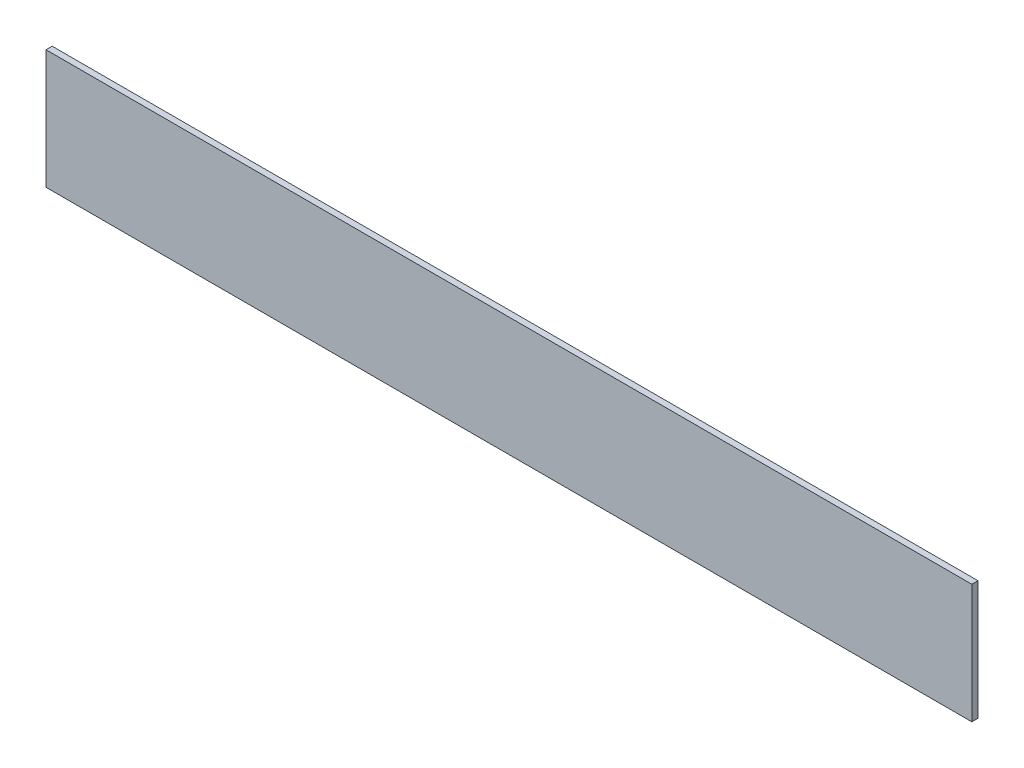
ISO-10303-21;
HEADER;
FILE_DESCRIPTION(('STEP AP214'),'2;1');
FILE_NAME('part.step','',(''),(''),'','','');
FILE_SCHEMA(('AUTOMOTIVE_DESIGN { 1 0 10303 214 1 1 1 1 }'));
ENDSEC;
DATA;
#1=APPLICATION_CONTEXT('core data for automotive mechanical design processes');
#2=APPLICATION_PROTOCOL_DEFINITION('international standard','automotive_design',2000,#1);
#3=PRODUCT_CONTEXT('',#1,'mechanical');
#4=PRODUCT('Part','Part','',(#3));
#5=PRODUCT_RELATED_PRODUCT_CATEGORY('part','',(#4));
#6=PRODUCT_DEFINITION_FORMATION('','',#4);
#7=PRODUCT_DEFINITION_CONTEXT('part definition',#1,'design');
#8=PRODUCT_DEFINITION('design','',#6,#7);
#9=PRODUCT_DEFINITION_SHAPE('','',#8);
#10=(LENGTH_UNIT() NAMED_UNIT(*) SI_UNIT(.MILLI.,.METRE.));
#11=(NAMED_UNIT(*) PLANE_ANGLE_UNIT() SI_UNIT($,.RADIAN.));
#12=(NAMED_UNIT(*) SI_UNIT($,.STERADIAN.) SOLID_ANGLE_UNIT());
#13=UNCERTAINTY_MEASURE_WITH_UNIT(LENGTH_MEASURE(1.E-05),#10,'distance_accuracy_value','');
#14=(GEOMETRIC_REPRESENTATION_CONTEXT(3) GLOBAL_UNCERTAINTY_ASSIGNED_CONTEXT((#13)) GLOBAL_UNIT_ASSIGNED_CONTEXT((#10,
#11,#12)) REPRESENTATION_CONTEXT('',''));
#15=CARTESIAN_POINT('',(0.,0.,0.));
#16=DIRECTION('',(0.,0.,1.));
#17=DIRECTION('',(1.,0.,0.));
#18=AXIS2_PLACEMENT_3D('',#15,#16,#17);
#19=CARTESIAN_POINT('',(0.,9.65,1.));
#20=DIRECTION('',(0.,-1.,0.));
#21=DIRECTION('',(1.,0.,0.));
#22=AXIS2_PLACEMENT_3D('',#19,#20,#21);
#23=PLANE('',#22);
#24=DIRECTION('',(-1.,0.,0.));
#25=VECTOR('',#24,1.);
#26=CARTESIAN_POINT('',(0.,9.65,0.));
#27=LINE('',#26,#25);
#28=CARTESIAN_POINT('',(0.,9.65,0.));
#29=VERTEX_POINT('',#28);
#30=CARTESIAN_POINT('',(-150.,9.64999999999998,0.));
#31=VERTEX_POINT('',#30);
#32=EDGE_CURVE('E110',#29,#31,#27,.T.);
#33=ORIENTED_EDGE('',*,*,#32,.T.);
#34=DIRECTION('',(0.,0.,-1.));
#35=VECTOR('',#34,1.);
#36=CARTESIAN_POINT('',(-150.,9.64999999999998,1.));
#37=LINE('',#36,#35);
#38=CARTESIAN_POINT('',(-150.,9.64999999999998,1.));
#39=VERTEX_POINT('',#38);
#40=EDGE_CURVE('E11',#39,#31,#37,.T.);
#41=ORIENTED_EDGE('',*,*,#40,.F.);
#42=DIRECTION('',(-1.,0.,0.));
#43=VECTOR('',#42,1.);
#44=CARTESIAN_POINT('',(0.,9.65,1.));
#45=LINE('',#44,#43);
#46=CARTESIAN_POINT('',(0.,9.65,1.));
#47=VERTEX_POINT('',#46);
#48=EDGE_CURVE('E91',#47,#39,#45,.T.);
#49=ORIENTED_EDGE('',*,*,#48,.F.);
#50=DIRECTION('',(0.,0.,-1.));
#51=VECTOR('',#50,1.);
#52=CARTESIAN_POINT('',(0.,9.65,1.));
#53=LINE('',#52,#51);
#54=EDGE_CURVE('E106',#47,#29,#53,.T.);
#55=ORIENTED_EDGE('',*,*,#54,.T.);
#56=EDGE_LOOP('',(#33,#41,#49,#55));
#57=FACE_BOUND('',#56,.T.);
#58=ADVANCED_FACE('F43',(#57),#23,.F.);
#59=CARTESIAN_POINT('',(-150.,0.,1.));
#60=DIRECTION('',(1.,0.,0.));
#61=DIRECTION('',(0.,0.,-1.));
#62=AXIS2_PLACEMENT_3D('',#59,#60,#61);
#63=PLANE('',#62);
#64=DIRECTION('',(0.,-1.,0.));
#65=VECTOR('',#64,1.);
#66=CARTESIAN_POINT('',(-150.,0.,0.));
#67=LINE('',#66,#65);
#68=CARTESIAN_POINT('',(-150.,-9.65,0.));
#69=VERTEX_POINT('',#68);
#70=EDGE_CURVE('E97',#31,#69,#67,.T.);
#71=ORIENTED_EDGE('',*,*,#70,.T.);
#72=DIRECTION('',(0.,0.,-1.));
#73=VECTOR('',#72,1.);
#74=CARTESIAN_POINT('',(-150.,-9.65,1.));
#75=LINE('',#74,#73);
#76=CARTESIAN_POINT('',(-150.,-9.65,1.));
#77=VERTEX_POINT('',#76);
#78=EDGE_CURVE('E52',#77,#69,#75,.T.);
#79=ORIENTED_EDGE('',*,*,#78,.F.);
#80=DIRECTION('',(0.,-1.,0.));
#81=VECTOR('',#80,1.);
#82=CARTESIAN_POINT('',(-150.,0.,1.));
#83=LINE('',#82,#81);
#84=EDGE_CURVE('E86',#39,#77,#83,.T.);
#85=ORIENTED_EDGE('',*,*,#84,.F.);
#86=ORIENTED_EDGE('',*,*,#40,.T.);
#87=EDGE_LOOP('',(#71,#79,#85,#86));
#88=FACE_BOUND('',#87,.T.);
#89=ADVANCED_FACE('F96',(#88),#63,.F.);
#90=CARTESIAN_POINT('',(0.,-9.65,1.));
#91=DIRECTION('',(0.,-1.,0.));
#92=DIRECTION('',(0.,0.,-1.));
#93=AXIS2_PLACEMENT_3D('',#90,#91,#92);
#94=PLANE('',#93);
#95=DIRECTION('',(-1.,0.,0.));
#96=VECTOR('',#95,1.);
#97=CARTESIAN_POINT('',(0.,-9.65,0.));
#98=LINE('',#97,#96);
#99=CARTESIAN_POINT('',(0.,-9.65,0.));
#100=VERTEX_POINT('',#99);
#101=EDGE_CURVE('E116',#100,#69,#98,.T.);
#102=ORIENTED_EDGE('',*,*,#101,.F.);
#103=DIRECTION('',(0.,0.,-1.));
#104=VECTOR('',#103,1.);
#105=CARTESIAN_POINT('',(0.,-9.65,1.));
#106=LINE('',#105,#104);
#107=CARTESIAN_POINT('',(0.,-9.65,1.));
#108=VERTEX_POINT('',#107);
#109=EDGE_CURVE('E76',#108,#100,#106,.T.);
#110=ORIENTED_EDGE('',*,*,#109,.F.);
#111=DIRECTION('',(-1.,0.,0.));
#112=VECTOR('',#111,1.);
#113=CARTESIAN_POINT('',(0.,-9.65,1.));
#114=LINE('',#113,#112);
#115=EDGE_CURVE('E89',#108,#77,#114,.T.);
#116=ORIENTED_EDGE('',*,*,#115,.T.);
#117=ORIENTED_EDGE('',*,*,#78,.T.);
#118=EDGE_LOOP('',(#102,#110,#116,#117));
#119=FACE_BOUND('',#118,.T.);
#120=ADVANCED_FACE('F102',(#119),#94,.T.);
#121=CARTESIAN_POINT('',(0.,0.,1.));
#122=DIRECTION('',(-1.,0.,0.));
#123=DIRECTION('',(0.,0.,1.));
#124=AXIS2_PLACEMENT_3D('',#121,#122,#123);
#125=PLANE('',#124);
#126=DIRECTION('',(0.,1.,0.));
#127=VECTOR('',#126,1.);
#128=CARTESIAN_POINT('',(0.,0.,0.));
#129=LINE('',#128,#127);
#130=EDGE_CURVE('E79',#100,#29,#129,.T.);
#131=ORIENTED_EDGE('',*,*,#130,.T.);
#132=ORIENTED_EDGE('',*,*,#54,.F.);
#133=DIRECTION('',(0.,1.,0.));
#134=VECTOR('',#133,1.);
#135=CARTESIAN_POINT('',(0.,0.,1.));
#136=LINE('',#135,#134);
#137=EDGE_CURVE('E60',#108,#47,#136,.T.);
#138=ORIENTED_EDGE('',*,*,#137,.F.);
#139=ORIENTED_EDGE('',*,*,#109,.T.);
#140=EDGE_LOOP('',(#131,#132,#138,#139));
#141=FACE_BOUND('',#140,.T.);
#142=ADVANCED_FACE('F133',(#141),#125,.F.);
#143=CARTESIAN_POINT('',(0.,0.,1.));
#144=DIRECTION('',(0.,0.,1.));
#145=DIRECTION('',(1.,0.,0.));
#146=AXIS2_PLACEMENT_3D('',#143,#144,#145);
#147=PLANE('',#146);
#148=ORIENTED_EDGE('',*,*,#48,.T.);
#149=ORIENTED_EDGE('',*,*,#84,.T.);
#150=ORIENTED_EDGE('',*,*,#115,.F.);
#151=ORIENTED_EDGE('',*,*,#137,.T.);
#152=EDGE_LOOP('',(#148,#149,#150,#151));
#153=FACE_BOUND('',#152,.T.);
#154=ADVANCED_FACE('F87',(#153),#147,.T.);
#155=CARTESIAN_POINT('',(0.,0.,0.));
#156=DIRECTION('',(0.,0.,1.));
#157=DIRECTION('',(1.,0.,0.));
#158=AXIS2_PLACEMENT_3D('',#155,#156,#157);
#159=PLANE('',#158);
#160=ORIENTED_EDGE('',*,*,#32,.F.);
#161=ORIENTED_EDGE('',*,*,#130,.F.);
#162=ORIENTED_EDGE('',*,*,#101,.T.);
#163=ORIENTED_EDGE('',*,*,#70,.F.);
#164=EDGE_LOOP('',(#160,#161,#162,#163));
#165=FACE_BOUND('',#164,.T.);
#166=ADVANCED_FACE('F127',(#165),#159,.F.);
#167=CLOSED_SHELL('',(#58,#89,#120,#142,#154,#166));
#168=MANIFOLD_SOLID_BREP('B2',#167);
#169=ADVANCED_BREP_SHAPE_REPRESENTATION('',(#18,#168),#14);
#170=SHAPE_DEFINITION_REPRESENTATION(#9,#169);
ENDSEC;
END-ISO-10303-21;
